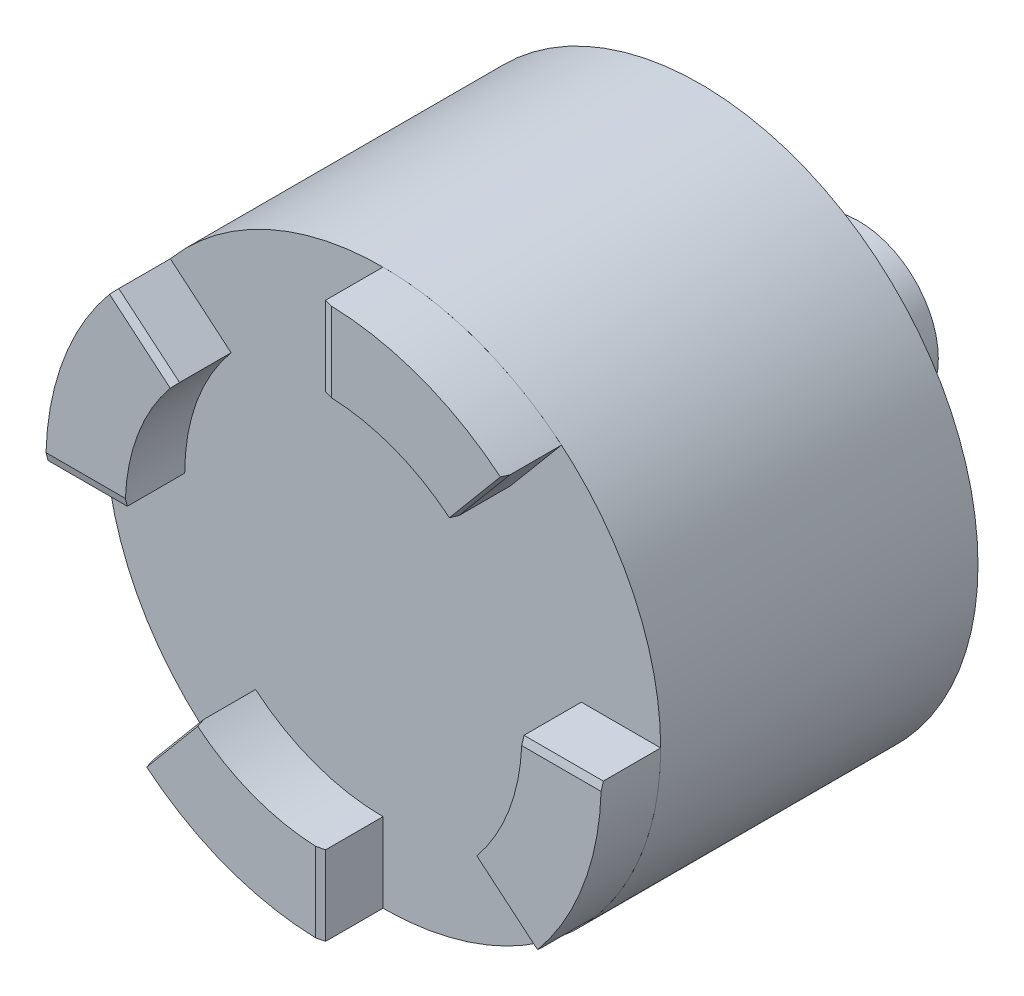
ISO-10303-21;
HEADER;
FILE_DESCRIPTION(('STEP AP214'),'2;1');
FILE_NAME('part.step','',(''),(''),'','','');
FILE_SCHEMA(('AUTOMOTIVE_DESIGN { 1 0 10303 214 1 1 1 1 }'));
ENDSEC;
DATA;
#1=APPLICATION_CONTEXT('core data for automotive mechanical design processes');
#2=APPLICATION_PROTOCOL_DEFINITION('international standard','automotive_design',2000,#1);
#3=PRODUCT_CONTEXT('',#1,'mechanical');
#4=PRODUCT('Part','Part','',(#3));
#5=PRODUCT_RELATED_PRODUCT_CATEGORY('part','',(#4));
#6=PRODUCT_DEFINITION_FORMATION('','',#4);
#7=PRODUCT_DEFINITION_CONTEXT('part definition',#1,'design');
#8=PRODUCT_DEFINITION('design','',#6,#7);
#9=PRODUCT_DEFINITION_SHAPE('','',#8);
#10=(LENGTH_UNIT() NAMED_UNIT(*) SI_UNIT(.MILLI.,.METRE.));
#11=(NAMED_UNIT(*) PLANE_ANGLE_UNIT() SI_UNIT($,.RADIAN.));
#12=(NAMED_UNIT(*) SI_UNIT($,.STERADIAN.) SOLID_ANGLE_UNIT());
#13=UNCERTAINTY_MEASURE_WITH_UNIT(LENGTH_MEASURE(1.E-05),#10,'distance_accuracy_value','');
#14=(GEOMETRIC_REPRESENTATION_CONTEXT(3) GLOBAL_UNCERTAINTY_ASSIGNED_CONTEXT((#13)) GLOBAL_UNIT_ASSIGNED_CONTEXT((#10,
#11,#12)) REPRESENTATION_CONTEXT('',''));
#15=CARTESIAN_POINT('',(0.,0.,0.));
#16=DIRECTION('',(0.,0.,1.));
#17=DIRECTION('',(1.,0.,0.));
#18=AXIS2_PLACEMENT_3D('',#15,#16,#17);
#19=CARTESIAN_POINT('',(-38.5953117709004,-1.19138897138363,29.1756320835275));
#20=DIRECTION('',(0.,0.,-1.));
#21=DIRECTION('',(-1.,0.,0.));
#22=AXIS2_PLACEMENT_3D('',#19,#20,#21);
#23=CYLINDRICAL_SURFACE('',#22,7.);
#24=CARTESIAN_POINT('',(-38.5953117709004,-1.19138897138363,29.1756320835275));
#25=DIRECTION('',(0.,0.,1.));
#26=DIRECTION('',(1.,0.,0.));
#27=AXIS2_PLACEMENT_3D('',#24,#25,#26);
#28=CIRCLE('',#27,7.);
#29=CARTESIAN_POINT('',(-31.5953117709004,-1.19138897138363,29.1756320835275));
#30=VERTEX_POINT('',#29);
#31=EDGE_CURVE('E11',#30,#30,#28,.T.);
#32=ORIENTED_EDGE('',*,*,#31,.F.);
#33=EDGE_LOOP('',(#32));
#34=FACE_BOUND('',#33,.T.);
#35=CARTESIAN_POINT('',(-38.5953117709004,-1.19138897138363,21.1756320835275));
#36=DIRECTION('',(0.,0.,1.));
#37=DIRECTION('',(1.,0.,0.));
#38=AXIS2_PLACEMENT_3D('',#35,#36,#37);
#39=CIRCLE('',#38,7.);
#40=CARTESIAN_POINT('',(-31.5953117709004,-1.19138897138363,21.1756320835275));
#41=VERTEX_POINT('',#40);
#42=EDGE_CURVE('E61',#41,#41,#39,.T.);
#43=ORIENTED_EDGE('',*,*,#42,.T.);
#44=EDGE_LOOP('',(#43));
#45=FACE_BOUND('',#44,.T.);
#46=ADVANCED_FACE('F54',(#34,#45),#23,.T.);
#47=CARTESIAN_POINT('',(-38.5953117709004,-1.19138897138363,29.1756320835275));
#48=DIRECTION('',(0.,0.,1.));
#49=DIRECTION('',(1.,0.,0.));
#50=AXIS2_PLACEMENT_3D('',#47,#48,#49);
#51=PLANE('',#50);
#52=ORIENTED_EDGE('',*,*,#31,.T.);
#53=EDGE_LOOP('',(#52));
#54=FACE_BOUND('',#53,.T.);
#55=ADVANCED_FACE('F101',(#54),#51,.T.);
#56=CARTESIAN_POINT('',(-38.5953117709004,-1.19138897138363,21.1756320835275));
#57=DIRECTION('',(0.,0.,1.));
#58=DIRECTION('',(1.,0.,0.));
#59=AXIS2_PLACEMENT_3D('',#56,#57,#58);
#60=PLANE('',#59);
#61=CARTESIAN_POINT('',(-38.5953117709004,-1.19138897138363,21.1756320835275));
#62=DIRECTION('',(0.,0.,1.));
#63=DIRECTION('',(1.,0.,0.));
#64=AXIS2_PLACEMENT_3D('',#61,#62,#63);
#65=CIRCLE('',#64,2.);
#66=CARTESIAN_POINT('',(-36.5953117709004,-1.19138897138363,21.1756320835275));
#67=VERTEX_POINT('',#66);
#68=EDGE_CURVE('E57',#67,#67,#65,.T.);
#69=ORIENTED_EDGE('',*,*,#68,.T.);
#70=EDGE_LOOP('',(#69));
#71=FACE_BOUND('',#70,.T.);
#72=ORIENTED_EDGE('',*,*,#42,.F.);
#73=EDGE_LOOP('',(#72));
#74=FACE_BOUND('',#73,.T.);
#75=ADVANCED_FACE('F94',(#71,#74),#60,.F.);
#76=CARTESIAN_POINT('',(-38.5953117709004,-1.19138897138363,17.1756320835275));
#77=DIRECTION('',(0.,0.,1.));
#78=DIRECTION('',(1.,0.,0.));
#79=AXIS2_PLACEMENT_3D('',#76,#77,#78);
#80=CYLINDRICAL_SURFACE('',#79,2.);
#81=CARTESIAN_POINT('',(-38.5953117709004,-1.19138897138363,17.1756320835275));
#82=DIRECTION('',(0.,0.,1.));
#83=DIRECTION('',(1.,0.,0.));
#84=AXIS2_PLACEMENT_3D('',#81,#82,#83);
#85=CIRCLE('',#84,2.);
#86=CARTESIAN_POINT('',(-36.5953117709004,-1.19138897138363,17.1756320835275));
#87=VERTEX_POINT('',#86);
#88=EDGE_CURVE('E67',#87,#87,#85,.T.);
#89=ORIENTED_EDGE('',*,*,#88,.T.);
#90=EDGE_LOOP('',(#89));
#91=FACE_BOUND('',#90,.T.);
#92=ORIENTED_EDGE('',*,*,#68,.F.);
#93=EDGE_LOOP('',(#92));
#94=FACE_BOUND('',#93,.T.);
#95=ADVANCED_FACE('F88',(#91,#94),#80,.T.);
#96=CARTESIAN_POINT('',(-38.5953117709004,-1.19138897138363,17.1756320835275));
#97=DIRECTION('',(0.,0.,1.));
#98=DIRECTION('',(1.,0.,0.));
#99=AXIS2_PLACEMENT_3D('',#96,#97,#98);
#100=PLANE('',#99);
#101=CARTESIAN_POINT('',(-38.5953117709004,-1.19138897138363,17.1756320835275));
#102=DIRECTION('',(0.,0.,-1.));
#103=DIRECTION('',(-1.,0.,0.));
#104=AXIS2_PLACEMENT_3D('',#101,#102,#103);
#105=CIRCLE('',#104,1.025);
#106=CARTESIAN_POINT('',(-39.6203117709004,-1.19138897138363,17.1756320835275));
#107=VERTEX_POINT('',#106);
#108=EDGE_CURVE('E71',#107,#107,#105,.T.);
#109=ORIENTED_EDGE('',*,*,#108,.F.);
#110=EDGE_LOOP('',(#109));
#111=FACE_BOUND('',#110,.T.);
#112=ORIENTED_EDGE('',*,*,#88,.F.);
#113=EDGE_LOOP('',(#112));
#114=FACE_BOUND('',#113,.T.);
#115=ADVANCED_FACE('F82',(#111,#114),#100,.F.);
#116=CARTESIAN_POINT('',(-38.5953117709004,-1.19138897138363,25.1756320835275));
#117=DIRECTION('',(0.,0.,-1.));
#118=DIRECTION('',(-1.,0.,0.));
#119=AXIS2_PLACEMENT_3D('',#116,#117,#118);
#120=CYLINDRICAL_SURFACE('',#119,1.025);
#121=CARTESIAN_POINT('',(-38.5953117709004,-1.19138897138363,25.1756320835275));
#122=DIRECTION('',(0.,0.,-1.));
#123=DIRECTION('',(-1.,0.,0.));
#124=AXIS2_PLACEMENT_3D('',#121,#122,#123);
#125=CIRCLE('',#124,1.025);
#126=CARTESIAN_POINT('',(-39.6203117709004,-1.19138897138363,25.1756320835275));
#127=VERTEX_POINT('',#126);
#128=EDGE_CURVE('E70',#127,#127,#125,.T.);
#129=ORIENTED_EDGE('',*,*,#128,.F.);
#130=EDGE_LOOP('',(#129));
#131=FACE_BOUND('',#130,.T.);
#132=ORIENTED_EDGE('',*,*,#108,.T.);
#133=EDGE_LOOP('',(#132));
#134=FACE_BOUND('',#133,.T.);
#135=ADVANCED_FACE('F79',(#131,#134),#120,.F.);
#136=CARTESIAN_POINT('',(-38.5953117709004,-1.19138897138363,25.1756320835275));
#137=DIRECTION('',(0.,0.,-1.));
#138=DIRECTION('',(-1.,0.,0.));
#139=AXIS2_PLACEMENT_3D('',#136,#137,#138);
#140=PLANE('',#139);
#141=ORIENTED_EDGE('',*,*,#128,.T.);
#142=EDGE_LOOP('',(#141));
#143=FACE_BOUND('',#142,.T.);
#144=ADVANCED_FACE('F77',(#143),#140,.T.);
#145=CLOSED_SHELL('',(#46,#55,#75,#95,#115,#135,#144));
#146=MANIFOLD_SOLID_BREP('B2',#145);
#147=CARTESIAN_POINT('',(-38.5953117709004,-1.19138897138363,30.6756320835275));
#148=DIRECTION('',(0.,-1.,0.));
#149=DIRECTION('',(0.,0.,1.));
#150=AXIS2_PLACEMENT_3D('',#147,#148,#149);
#151=PLANE('',#150);
#152=DIRECTION('',(0.,0.,-1.));
#153=VECTOR('',#152,1.);
#154=CARTESIAN_POINT('',(-43.5953117709004,-1.19138897138358,30.6756320835275));
#155=LINE('',#154,#153);
#156=CARTESIAN_POINT('',(-43.5953117709004,-1.19138897138358,30.6220422450412));
#157=VERTEX_POINT('',#156);
#158=CARTESIAN_POINT('',(-43.5953117709004,-1.19138897138358,29.1756320835275));
#159=VERTEX_POINT('',#158);
#160=EDGE_CURVE('E230',#157,#159,#155,.T.);
#161=ORIENTED_EDGE('',*,*,#160,.F.);
#162=DIRECTION('',(-1.,0.,0.));
#163=VECTOR('',#162,1.);
#164=CARTESIAN_POINT('',(-38.5953117709004,-1.19138897138363,30.6220422450412));
#165=LINE('',#164,#163);
#166=CARTESIAN_POINT('',(-45.5953117709004,-1.19138897138355,30.6220422450412));
#167=VERTEX_POINT('',#166);
#168=EDGE_CURVE('E240',#157,#167,#165,.T.);
#169=ORIENTED_EDGE('',*,*,#168,.T.);
#170=DIRECTION('',(0.,0.,-1.));
#171=VECTOR('',#170,1.);
#172=CARTESIAN_POINT('',(-45.5953117709004,-1.19138897138355,30.6756320835275));
#173=LINE('',#172,#171);
#174=CARTESIAN_POINT('',(-45.5953117709004,-1.19138897138355,29.1756320835275));
#175=VERTEX_POINT('',#174);
#176=EDGE_CURVE('E252',#167,#175,#173,.T.);
#177=ORIENTED_EDGE('',*,*,#176,.T.);
#178=DIRECTION('',(-1.,0.,0.));
#179=VECTOR('',#178,1.);
#180=CARTESIAN_POINT('',(-38.5953117709004,-1.19138897138363,29.1756320835275));
#181=LINE('',#180,#179);
#182=EDGE_CURVE('E247',#159,#175,#181,.T.);
#183=ORIENTED_EDGE('',*,*,#182,.F.);
#184=EDGE_LOOP('',(#161,#169,#177,#183));
#185=FACE_BOUND('',#184,.T.);
#186=ADVANCED_FACE('F177',(#185),#151,.T.);
#187=CARTESIAN_POINT('',(-38.5953117709004,-1.19138897138363,30.6756320835275));
#188=DIRECTION('',(0.,0.,-1.));
#189=DIRECTION('',(0.,-1.,0.));
#190=AXIS2_PLACEMENT_3D('',#187,#188,#189);
#191=CYLINDRICAL_SURFACE('',#190,5.);
#192=CARTESIAN_POINT('',(-38.5953117709004,-1.19138897138363,30.6756320835275));
#193=DIRECTION('',(0.,0.,1.));
#194=DIRECTION('',(0.,1.,0.));
#195=AXIS2_PLACEMENT_3D('',#192,#193,#194);
#196=CIRCLE('',#195,5.);
#197=CARTESIAN_POINT('',(-43.5913101696191,-0.991388971383578,30.6756320835275));
#198=VERTEX_POINT('',#197);
#199=CARTESIAN_POINT('',(-42.4597608662949,1.98131227347133,30.6756320835275));
#200=VERTEX_POINT('',#199);
#201=EDGE_CURVE('E262',#198,#200,#196,.F.);
#202=ORIENTED_EDGE('',*,*,#201,.F.);
#203=CARTESIAN_POINT('',(-38.5953117709004,-1.19138897138363,30.6220422450412));
#204=DIRECTION('',(0.,0.258819045102524,-0.965925826289067));
#205=DIRECTION('',(0.,-0.965925826289068,-0.258819045102524));
#206=AXIS2_PLACEMENT_3D('',#203,#204,#205);
#207=ELLIPSE('',#206,5.17638090205042,5.);
#208=EDGE_CURVE('E186',#198,#157,#207,.F.);
#209=ORIENTED_EDGE('',*,*,#208,.T.);
#210=ORIENTED_EDGE('',*,*,#160,.T.);
#211=CARTESIAN_POINT('',(-38.5953117709004,-1.19138897138363,29.1756320835275));
#212=DIRECTION('',(0.,0.,1.));
#213=DIRECTION('',(0.,1.,0.));
#214=AXIS2_PLACEMENT_3D('',#211,#212,#213);
#215=CIRCLE('',#214,5.);
#216=CARTESIAN_POINT('',(-42.4255339864952,2.02254907704911,29.1756320835275));
#217=VERTEX_POINT('',#216);
#218=EDGE_CURVE('E233',#159,#217,#215,.F.);
#219=ORIENTED_EDGE('',*,*,#218,.T.);
#220=DIRECTION('',(0.,0.,-1.));
#221=VECTOR('',#220,1.);
#222=CARTESIAN_POINT('',(-42.4255339864952,2.02254907704911,30.6756320835275));
#223=LINE('',#222,#221);
#224=CARTESIAN_POINT('',(-42.4255339864952,2.02254907704911,30.4756320835275));
#225=VERTEX_POINT('',#224);
#226=EDGE_CURVE('E241',#225,#217,#223,.T.);
#227=ORIENTED_EDGE('',*,*,#226,.F.);
#228=CARTESIAN_POINT('',(-38.5953117709004,-1.19138897138363,30.4756320835275));
#229=DIRECTION('',(0.620885153014855,0.739942111693841,0.258819045102516));
#230=DIRECTION('',(0.166365675342801,0.198266891274141,-0.96592582628907));
#231=AXIS2_PLACEMENT_3D('',#228,#229,#230);
#232=ELLIPSE('',#231,19.3185165257817,5.);
#233=EDGE_CURVE('E198',#225,#200,#232,.T.);
#234=ORIENTED_EDGE('',*,*,#233,.T.);
#235=EDGE_LOOP('',(#202,#209,#210,#219,#227,#234));
#236=FACE_BOUND('',#235,.T.);
#237=ADVANCED_FACE('F232',(#236),#191,.F.);
#238=CARTESIAN_POINT('',(-38.5953117709004,-1.19138897138363,30.6756320835275));
#239=DIRECTION('',(-0.642787609686548,-0.76604444311897,0.));
#240=DIRECTION('',(0.76604444311897,-0.642787609686548,0.));
#241=AXIS2_PLACEMENT_3D('',#238,#239,#240);
#242=PLANE('',#241);
#243=DIRECTION('',(0.,0.,-1.));
#244=VECTOR('',#243,1.);
#245=CARTESIAN_POINT('',(-43.9576228727332,3.30812429642221,30.6756320835275));
#246=LINE('',#245,#244);
#247=CARTESIAN_POINT('',(-43.9576228727332,3.30812429642221,30.4756320835275));
#248=VERTEX_POINT('',#247);
#249=CARTESIAN_POINT('',(-43.9576228727332,3.30812429642221,29.1756320835275));
#250=VERTEX_POINT('',#249);
#251=EDGE_CURVE('E264',#248,#250,#246,.T.);
#252=ORIENTED_EDGE('',*,*,#251,.F.);
#253=DIRECTION('',(0.76604444311897,-0.642787609686548,0.));
#254=VECTOR('',#253,1.);
#255=CARTESIAN_POINT('',(-42.4255339864952,2.02254907704911,30.4756320835275));
#256=LINE('',#255,#254);
#257=EDGE_CURVE('E52',#248,#225,#256,.T.);
#258=ORIENTED_EDGE('',*,*,#257,.T.);
#259=ORIENTED_EDGE('',*,*,#226,.T.);
#260=DIRECTION('',(-0.76604444311897,0.642787609686548,0.));
#261=VECTOR('',#260,1.);
#262=CARTESIAN_POINT('',(-38.5953117709004,-1.19138897138363,29.1756320835275));
#263=LINE('',#262,#261);
#264=EDGE_CURVE('E249',#217,#250,#263,.T.);
#265=ORIENTED_EDGE('',*,*,#264,.T.);
#266=EDGE_LOOP('',(#252,#258,#259,#265));
#267=FACE_BOUND('',#266,.T.);
#268=ADVANCED_FACE('F287',(#267),#242,.F.);
#269=CARTESIAN_POINT('',(-38.5953117709004,-1.19138897138363,30.6756320835275));
#270=DIRECTION('',(0.,0.,-1.));
#271=DIRECTION('',(0.,-1.,0.));
#272=AXIS2_PLACEMENT_3D('',#269,#270,#271);
#273=CYLINDRICAL_SURFACE('',#272,7.);
#274=ORIENTED_EDGE('',*,*,#176,.F.);
#275=CARTESIAN_POINT('',(-38.5953117709004,-1.19138897138363,30.6220422450412));
#276=DIRECTION('',(0.,0.258819045102524,-0.965925826289067));
#277=DIRECTION('',(0.,-0.965925826289068,-0.258819045102524));
#278=AXIS2_PLACEMENT_3D('',#275,#276,#277);
#279=ELLIPSE('',#278,7.24693326287059,7.);
#280=CARTESIAN_POINT('',(-45.5924540447147,-0.991388971383557,30.6756320835275));
#281=VERTEX_POINT('',#280);
#282=EDGE_CURVE('E270',#167,#281,#279,.T.);
#283=ORIENTED_EDGE('',*,*,#282,.T.);
#284=CARTESIAN_POINT('',(-38.5953117709004,-1.19138897138363,30.6756320835275));
#285=DIRECTION('',(0.,0.,1.));
#286=DIRECTION('',(0.,1.,0.));
#287=AXIS2_PLACEMENT_3D('',#284,#285,#286);
#288=CIRCLE('',#287,7.);
#289=CARTESIAN_POINT('',(-43.991912613139,3.26694023915584,30.6756320835275));
#290=VERTEX_POINT('',#289);
#291=EDGE_CURVE('E256',#290,#281,#288,.T.);
#292=ORIENTED_EDGE('',*,*,#291,.F.);
#293=CARTESIAN_POINT('',(-38.5953117709004,-1.19138897138363,30.4756320835275));
#294=DIRECTION('',(0.620885153014855,0.739942111693841,0.258819045102516));
#295=DIRECTION('',(0.166365675342801,0.198266891274141,-0.96592582628907));
#296=AXIS2_PLACEMENT_3D('',#293,#294,#295);
#297=ELLIPSE('',#296,27.0459231360944,7.);
#298=EDGE_CURVE('E268',#290,#248,#297,.F.);
#299=ORIENTED_EDGE('',*,*,#298,.T.);
#300=ORIENTED_EDGE('',*,*,#251,.T.);
#301=CARTESIAN_POINT('',(-38.5953117709004,-1.19138897138363,29.1756320835275));
#302=DIRECTION('',(0.,0.,1.));
#303=DIRECTION('',(0.,1.,0.));
#304=AXIS2_PLACEMENT_3D('',#301,#302,#303);
#305=CIRCLE('',#304,7.);
#306=EDGE_CURVE('E260',#250,#175,#305,.T.);
#307=ORIENTED_EDGE('',*,*,#306,.T.);
#308=EDGE_LOOP('',(#274,#283,#292,#299,#300,#307));
#309=FACE_BOUND('',#308,.T.);
#310=ADVANCED_FACE('F286',(#309),#273,.T.);
#311=CARTESIAN_POINT('',(-38.5953117709004,-1.19138897138363,30.6756320835275));
#312=DIRECTION('',(0.,0.,1.));
#313=DIRECTION('',(0.,1.,0.));
#314=AXIS2_PLACEMENT_3D('',#311,#312,#313);
#315=PLANE('',#314);
#316=ORIENTED_EDGE('',*,*,#291,.T.);
#317=DIRECTION('',(1.,0.,0.));
#318=VECTOR('',#317,1.);
#319=CARTESIAN_POINT('',(-38.5953117709004,-0.99138897138363,30.6756320835275));
#320=LINE('',#319,#318);
#321=EDGE_CURVE('E275',#281,#198,#320,.T.);
#322=ORIENTED_EDGE('',*,*,#321,.T.);
#323=ORIENTED_EDGE('',*,*,#201,.T.);
#324=DIRECTION('',(-0.76604444311897,0.642787609686548,0.));
#325=VECTOR('',#324,1.);
#326=CARTESIAN_POINT('',(-43.9920697569172,3.2670720984422,30.6756320835275));
#327=LINE('',#326,#325);
#328=EDGE_CURVE('E272',#200,#290,#327,.T.);
#329=ORIENTED_EDGE('',*,*,#328,.T.);
#330=EDGE_LOOP('',(#316,#322,#323,#329));
#331=FACE_BOUND('',#330,.T.);
#332=ADVANCED_FACE('F280',(#331),#315,.T.);
#333=CARTESIAN_POINT('',(-38.5953117709004,-1.19138897138363,29.1756320835275));
#334=DIRECTION('',(0.,0.,1.));
#335=DIRECTION('',(0.,1.,0.));
#336=AXIS2_PLACEMENT_3D('',#333,#334,#335);
#337=PLANE('',#336);
#338=ORIENTED_EDGE('',*,*,#182,.T.);
#339=ORIENTED_EDGE('',*,*,#306,.F.);
#340=ORIENTED_EDGE('',*,*,#264,.F.);
#341=ORIENTED_EDGE('',*,*,#218,.F.);
#342=EDGE_LOOP('',(#338,#339,#340,#341));
#343=FACE_BOUND('',#342,.T.);
#344=ADVANCED_FACE('F245',(#343),#337,.F.);
#345=CARTESIAN_POINT('',(-38.5953117709004,-1.19138897138363,30.6220422450412));
#346=DIRECTION('',(0.,0.258819045102524,-0.965925826289067));
#347=DIRECTION('',(-1.,0.,0.));
#348=AXIS2_PLACEMENT_3D('',#345,#346,#347);
#349=PLANE('',#348);
#350=ORIENTED_EDGE('',*,*,#208,.F.);
#351=ORIENTED_EDGE('',*,*,#321,.F.);
#352=ORIENTED_EDGE('',*,*,#282,.F.);
#353=ORIENTED_EDGE('',*,*,#168,.F.);
#354=EDGE_LOOP('',(#350,#351,#352,#353));
#355=FACE_BOUND('',#354,.T.);
#356=ADVANCED_FACE('F284',(#355),#349,.F.);
#357=CARTESIAN_POINT('',(-38.6297586550844,-1.23244116936364,30.6756320835275));
#358=DIRECTION('',(0.620885153014855,0.739942111693841,0.258819045102516));
#359=DIRECTION('',(0.76604444311897,-0.642787609686548,0.));
#360=AXIS2_PLACEMENT_3D('',#357,#358,#359);
#361=PLANE('',#360);
#362=ORIENTED_EDGE('',*,*,#233,.F.);
#363=ORIENTED_EDGE('',*,*,#257,.F.);
#364=ORIENTED_EDGE('',*,*,#298,.F.);
#365=ORIENTED_EDGE('',*,*,#328,.F.);
#366=EDGE_LOOP('',(#362,#363,#364,#365));
#367=FACE_BOUND('',#366,.T.);
#368=ADVANCED_FACE('F180',(#367),#361,.T.);
#369=CLOSED_SHELL('',(#186,#237,#268,#310,#332,#344,#356,#368));
#370=MANIFOLD_SOLID_BREP('B6',#369);
#371=CARTESIAN_POINT('',(-38.5953117709004,-1.19138897138363,30.6756320835275));
#372=DIRECTION('',(1.,0.,0.));
#373=DIRECTION('',(0.,0.,1.));
#374=AXIS2_PLACEMENT_3D('',#371,#372,#373);
#375=PLANE('',#374);
#376=DIRECTION('',(0.,0.,-1.));
#377=VECTOR('',#376,1.);
#378=CARTESIAN_POINT('',(-38.5953117709004,-6.19138897138363,30.6756320835275));
#379=LINE('',#378,#377);
#380=CARTESIAN_POINT('',(-38.5953117709004,-6.19138897138363,30.6220422450412));
#381=VERTEX_POINT('',#380);
#382=CARTESIAN_POINT('',(-38.5953117709004,-6.19138897138363,29.1756320835275));
#383=VERTEX_POINT('',#382);
#384=EDGE_CURVE('E431',#381,#383,#379,.T.);
#385=ORIENTED_EDGE('',*,*,#384,.F.);
#386=DIRECTION('',(0.,-1.,0.));
#387=VECTOR('',#386,1.);
#388=CARTESIAN_POINT('',(-38.5953117709004,-1.19138897138363,30.6220422450412));
#389=LINE('',#388,#387);
#390=CARTESIAN_POINT('',(-38.5953117709004,-8.19138897138363,30.6220422450412));
#391=VERTEX_POINT('',#390);
#392=EDGE_CURVE('E441',#381,#391,#389,.T.);
#393=ORIENTED_EDGE('',*,*,#392,.T.);
#394=DIRECTION('',(0.,0.,-1.));
#395=VECTOR('',#394,1.);
#396=CARTESIAN_POINT('',(-38.5953117709004,-8.19138897138363,30.6756320835275));
#397=LINE('',#396,#395);
#398=CARTESIAN_POINT('',(-38.5953117709004,-8.19138897138363,29.1756320835275));
#399=VERTEX_POINT('',#398);
#400=EDGE_CURVE('E453',#391,#399,#397,.T.);
#401=ORIENTED_EDGE('',*,*,#400,.T.);
#402=DIRECTION('',(0.,-1.,0.));
#403=VECTOR('',#402,1.);
#404=CARTESIAN_POINT('',(-38.5953117709004,-1.19138897138363,29.1756320835275));
#405=LINE('',#404,#403);
#406=EDGE_CURVE('E448',#383,#399,#405,.T.);
#407=ORIENTED_EDGE('',*,*,#406,.F.);
#408=EDGE_LOOP('',(#385,#393,#401,#407));
#409=FACE_BOUND('',#408,.T.);
#410=ADVANCED_FACE('F378',(#409),#375,.T.);
#411=CARTESIAN_POINT('',(-38.5953117709004,-1.19138897138363,30.6756320835275));
#412=DIRECTION('',(0.,0.,-1.));
#413=DIRECTION('',(1.,0.,0.));
#414=AXIS2_PLACEMENT_3D('',#411,#412,#413);
#415=CYLINDRICAL_SURFACE('',#414,5.);
#416=CARTESIAN_POINT('',(-38.5953117709004,-1.19138897138363,30.6756320835275));
#417=DIRECTION('',(0.,0.,1.));
#418=DIRECTION('',(-1.,0.,0.));
#419=AXIS2_PLACEMENT_3D('',#416,#417,#418);
#420=CIRCLE('',#419,5.);
#421=CARTESIAN_POINT('',(-38.7953117709004,-6.18738737010235,30.6756320835275));
#422=VERTEX_POINT('',#421);
#423=CARTESIAN_POINT('',(-41.7680130157553,-5.05583806677821,30.6756320835275));
#424=VERTEX_POINT('',#423);
#425=EDGE_CURVE('E463',#422,#424,#420,.F.);
#426=ORIENTED_EDGE('',*,*,#425,.F.);
#427=CARTESIAN_POINT('',(-38.5953117709004,-1.19138897138363,30.6220422450412));
#428=DIRECTION('',(-0.258819045102524,0.,-0.965925826289067));
#429=DIRECTION('',(0.965925826289068,0.,-0.258819045102524));
#430=AXIS2_PLACEMENT_3D('',#427,#428,#429);
#431=ELLIPSE('',#430,5.17638090205042,5.);
#432=EDGE_CURVE('E387',#422,#381,#431,.F.);
#433=ORIENTED_EDGE('',*,*,#432,.T.);
#434=ORIENTED_EDGE('',*,*,#384,.T.);
#435=CARTESIAN_POINT('',(-38.5953117709004,-1.19138897138363,29.1756320835275));
#436=DIRECTION('',(0.,0.,1.));
#437=DIRECTION('',(-1.,0.,0.));
#438=AXIS2_PLACEMENT_3D('',#435,#436,#437);
#439=CIRCLE('',#438,5.);
#440=CARTESIAN_POINT('',(-41.8092498193331,-5.02161118697851,29.1756320835275));
#441=VERTEX_POINT('',#440);
#442=EDGE_CURVE('E434',#383,#441,#439,.F.);
#443=ORIENTED_EDGE('',*,*,#442,.T.);
#444=DIRECTION('',(0.,0.,-1.));
#445=VECTOR('',#444,1.);
#446=CARTESIAN_POINT('',(-41.8092498193331,-5.02161118697851,30.6756320835275));
#447=LINE('',#446,#445);
#448=CARTESIAN_POINT('',(-41.8092498193331,-5.02161118697851,30.4756320835275));
#449=VERTEX_POINT('',#448);
#450=EDGE_CURVE('E442',#449,#441,#447,.T.);
#451=ORIENTED_EDGE('',*,*,#450,.F.);
#452=CARTESIAN_POINT('',(-38.5953117709004,-1.19138897138363,30.4756320835275));
#453=DIRECTION('',(-0.739942111693848,0.620885153014847,0.258819045102516));
#454=DIRECTION('',(-0.198266891274143,0.166365675342799,-0.96592582628907));
#455=AXIS2_PLACEMENT_3D('',#452,#453,#454);
#456=ELLIPSE('',#455,19.3185165257817,5.);
#457=EDGE_CURVE('E399',#449,#424,#456,.T.);
#458=ORIENTED_EDGE('',*,*,#457,.T.);
#459=EDGE_LOOP('',(#426,#433,#434,#443,#451,#458));
#460=FACE_BOUND('',#459,.T.);
#461=ADVANCED_FACE('F433',(#460),#415,.F.);
#462=CARTESIAN_POINT('',(-38.5953117709004,-1.19138897138363,30.6756320835275));
#463=DIRECTION('',(0.766044443118977,-0.64278760968654,0.));
#464=DIRECTION('',(0.64278760968654,0.766044443118977,0.));
#465=AXIS2_PLACEMENT_3D('',#462,#463,#464);
#466=PLANE('',#465);
#467=DIRECTION('',(0.,0.,-1.));
#468=VECTOR('',#467,1.);
#469=CARTESIAN_POINT('',(-43.0948250387062,-6.55370007321647,30.6756320835275));
#470=LINE('',#469,#468);
#471=CARTESIAN_POINT('',(-43.0948250387062,-6.55370007321647,30.4756320835275));
#472=VERTEX_POINT('',#471);
#473=CARTESIAN_POINT('',(-43.0948250387062,-6.55370007321647,29.1756320835275));
#474=VERTEX_POINT('',#473);
#475=EDGE_CURVE('E465',#472,#474,#470,.T.);
#476=ORIENTED_EDGE('',*,*,#475,.F.);
#477=DIRECTION('',(0.64278760968654,0.766044443118977,0.));
#478=VECTOR('',#477,1.);
#479=CARTESIAN_POINT('',(-41.8092498193331,-5.02161118697851,30.4756320835275));
#480=LINE('',#479,#478);
#481=EDGE_CURVE('E175',#472,#449,#480,.T.);
#482=ORIENTED_EDGE('',*,*,#481,.T.);
#483=ORIENTED_EDGE('',*,*,#450,.T.);
#484=DIRECTION('',(-0.64278760968654,-0.766044443118977,0.));
#485=VECTOR('',#484,1.);
#486=CARTESIAN_POINT('',(-38.5953117709004,-1.19138897138363,29.1756320835275));
#487=LINE('',#486,#485);
#488=EDGE_CURVE('E450',#441,#474,#487,.T.);
#489=ORIENTED_EDGE('',*,*,#488,.T.);
#490=EDGE_LOOP('',(#476,#482,#483,#489));
#491=FACE_BOUND('',#490,.T.);
#492=ADVANCED_FACE('F488',(#491),#466,.F.);
#493=CARTESIAN_POINT('',(-38.5953117709004,-1.19138897138363,30.6756320835275));
#494=DIRECTION('',(0.,0.,-1.));
#495=DIRECTION('',(1.,0.,0.));
#496=AXIS2_PLACEMENT_3D('',#493,#494,#495);
#497=CYLINDRICAL_SURFACE('',#496,7.);
#498=ORIENTED_EDGE('',*,*,#400,.F.);
#499=CARTESIAN_POINT('',(-38.5953117709004,-1.19138897138363,30.6220422450412));
#500=DIRECTION('',(-0.258819045102524,0.,-0.965925826289067));
#501=DIRECTION('',(0.965925826289068,0.,-0.258819045102524));
#502=AXIS2_PLACEMENT_3D('',#499,#500,#501);
#503=ELLIPSE('',#502,7.24693326287059,7.);
#504=CARTESIAN_POINT('',(-38.7953117709004,-8.18853124519799,30.6756320835275));
#505=VERTEX_POINT('',#504);
#506=EDGE_CURVE('E471',#391,#505,#503,.T.);
#507=ORIENTED_EDGE('',*,*,#506,.T.);
#508=CARTESIAN_POINT('',(-38.5953117709004,-1.19138897138363,30.6756320835275));
#509=DIRECTION('',(0.,0.,1.));
#510=DIRECTION('',(-1.,0.,0.));
#511=AXIS2_PLACEMENT_3D('',#508,#509,#510);
#512=CIRCLE('',#511,7.);
#513=CARTESIAN_POINT('',(-43.0536409814398,-6.58798981362229,30.6756320835275));
#514=VERTEX_POINT('',#513);
#515=EDGE_CURVE('E457',#514,#505,#512,.T.);
#516=ORIENTED_EDGE('',*,*,#515,.F.);
#517=CARTESIAN_POINT('',(-38.5953117709004,-1.19138897138363,30.4756320835275));
#518=DIRECTION('',(-0.739942111693848,0.620885153014847,0.258819045102516));
#519=DIRECTION('',(-0.198266891274143,0.166365675342799,-0.96592582628907));
#520=AXIS2_PLACEMENT_3D('',#517,#518,#519);
#521=ELLIPSE('',#520,27.0459231360944,7.);
#522=EDGE_CURVE('E469',#514,#472,#521,.F.);
#523=ORIENTED_EDGE('',*,*,#522,.T.);
#524=ORIENTED_EDGE('',*,*,#475,.T.);
#525=CARTESIAN_POINT('',(-38.5953117709004,-1.19138897138363,29.1756320835275));
#526=DIRECTION('',(0.,0.,1.));
#527=DIRECTION('',(-1.,0.,0.));
#528=AXIS2_PLACEMENT_3D('',#525,#526,#527);
#529=CIRCLE('',#528,7.);
#530=EDGE_CURVE('E461',#474,#399,#529,.T.);
#531=ORIENTED_EDGE('',*,*,#530,.T.);
#532=EDGE_LOOP('',(#498,#507,#516,#523,#524,#531));
#533=FACE_BOUND('',#532,.T.);
#534=ADVANCED_FACE('F487',(#533),#497,.T.);
#535=CARTESIAN_POINT('',(-38.5953117709004,-1.19138897138363,30.6756320835275));
#536=DIRECTION('',(0.,0.,1.));
#537=DIRECTION('',(-1.,0.,0.));
#538=AXIS2_PLACEMENT_3D('',#535,#536,#537);
#539=PLANE('',#538);
#540=ORIENTED_EDGE('',*,*,#515,.T.);
#541=DIRECTION('',(0.,1.,0.));
#542=VECTOR('',#541,1.);
#543=CARTESIAN_POINT('',(-38.7953117709004,-1.19138897138363,30.6756320835275));
#544=LINE('',#543,#542);
#545=EDGE_CURVE('E476',#505,#422,#544,.T.);
#546=ORIENTED_EDGE('',*,*,#545,.T.);
#547=ORIENTED_EDGE('',*,*,#425,.T.);
#548=DIRECTION('',(-0.64278760968654,-0.766044443118977,0.));
#549=VECTOR('',#548,1.);
#550=CARTESIAN_POINT('',(-43.0537728407262,-6.58814695740052,30.6756320835275));
#551=LINE('',#550,#549);
#552=EDGE_CURVE('E473',#424,#514,#551,.T.);
#553=ORIENTED_EDGE('',*,*,#552,.T.);
#554=EDGE_LOOP('',(#540,#546,#547,#553));
#555=FACE_BOUND('',#554,.T.);
#556=ADVANCED_FACE('F481',(#555),#539,.T.);
#557=CARTESIAN_POINT('',(-38.5953117709004,-1.19138897138363,29.1756320835275));
#558=DIRECTION('',(0.,0.,1.));
#559=DIRECTION('',(-1.,0.,0.));
#560=AXIS2_PLACEMENT_3D('',#557,#558,#559);
#561=PLANE('',#560);
#562=ORIENTED_EDGE('',*,*,#406,.T.);
#563=ORIENTED_EDGE('',*,*,#530,.F.);
#564=ORIENTED_EDGE('',*,*,#488,.F.);
#565=ORIENTED_EDGE('',*,*,#442,.F.);
#566=EDGE_LOOP('',(#562,#563,#564,#565));
#567=FACE_BOUND('',#566,.T.);
#568=ADVANCED_FACE('F446',(#567),#561,.F.);
#569=CARTESIAN_POINT('',(-38.5953117709004,-1.19138897138363,30.6220422450412));
#570=DIRECTION('',(-0.258819045102524,0.,-0.965925826289067));
#571=DIRECTION('',(0.,-1.,0.));
#572=AXIS2_PLACEMENT_3D('',#569,#570,#571);
#573=PLANE('',#572);
#574=ORIENTED_EDGE('',*,*,#432,.F.);
#575=ORIENTED_EDGE('',*,*,#545,.F.);
#576=ORIENTED_EDGE('',*,*,#506,.F.);
#577=ORIENTED_EDGE('',*,*,#392,.F.);
#578=EDGE_LOOP('',(#574,#575,#576,#577));
#579=FACE_BOUND('',#578,.T.);
#580=ADVANCED_FACE('F485',(#579),#573,.F.);
#581=CARTESIAN_POINT('',(-38.5542595729204,-1.22583585556768,30.6756320835275));
#582=DIRECTION('',(-0.739942111693848,0.620885153014847,0.258819045102516));
#583=DIRECTION('',(0.64278760968654,0.766044443118977,0.));
#584=AXIS2_PLACEMENT_3D('',#581,#582,#583);
#585=PLANE('',#584);
#586=ORIENTED_EDGE('',*,*,#457,.F.);
#587=ORIENTED_EDGE('',*,*,#481,.F.);
#588=ORIENTED_EDGE('',*,*,#522,.F.);
#589=ORIENTED_EDGE('',*,*,#552,.F.);
#590=EDGE_LOOP('',(#586,#587,#588,#589));
#591=FACE_BOUND('',#590,.T.);
#592=ADVANCED_FACE('F381',(#591),#585,.T.);
#593=CLOSED_SHELL('',(#410,#461,#492,#534,#556,#568,#580,#592));
#594=MANIFOLD_SOLID_BREP('B46',#593);
#595=CARTESIAN_POINT('',(-38.5953117709004,-1.19138897138363,30.6756320835275));
#596=DIRECTION('',(0.,1.,0.));
#597=DIRECTION('',(0.,0.,1.));
#598=AXIS2_PLACEMENT_3D('',#595,#596,#597);
#599=PLANE('',#598);
#600=DIRECTION('',(0.,0.,-1.));
#601=VECTOR('',#600,1.);
#602=CARTESIAN_POINT('',(-33.5953117709004,-1.19138897138365,30.6756320835275));
#603=LINE('',#602,#601);
#604=CARTESIAN_POINT('',(-33.5953117709004,-1.19138897138365,30.6220422450412));
#605=VERTEX_POINT('',#604);
#606=CARTESIAN_POINT('',(-33.5953117709004,-1.19138897138365,29.1756320835275));
#607=VERTEX_POINT('',#606);
#608=EDGE_CURVE('E631',#605,#607,#603,.T.);
#609=ORIENTED_EDGE('',*,*,#608,.F.);
#610=DIRECTION('',(1.,0.,0.));
#611=VECTOR('',#610,1.);
#612=CARTESIAN_POINT('',(-38.5953117709004,-1.19138897138363,30.6220422450412));
#613=LINE('',#612,#611);
#614=CARTESIAN_POINT('',(-31.5953117709004,-1.19138897138365,30.6220422450412));
#615=VERTEX_POINT('',#614);
#616=EDGE_CURVE('E641',#605,#615,#613,.T.);
#617=ORIENTED_EDGE('',*,*,#616,.T.);
#618=DIRECTION('',(0.,0.,-1.));
#619=VECTOR('',#618,1.);
#620=CARTESIAN_POINT('',(-31.5953117709004,-1.19138897138365,30.6756320835275));
#621=LINE('',#620,#619);
#622=CARTESIAN_POINT('',(-31.5953117709004,-1.19138897138365,29.1756320835275));
#623=VERTEX_POINT('',#622);
#624=EDGE_CURVE('E653',#615,#623,#621,.T.);
#625=ORIENTED_EDGE('',*,*,#624,.T.);
#626=DIRECTION('',(1.,0.,0.));
#627=VECTOR('',#626,1.);
#628=CARTESIAN_POINT('',(-38.5953117709004,-1.19138897138363,29.1756320835275));
#629=LINE('',#628,#627);
#630=EDGE_CURVE('E648',#607,#623,#629,.T.);
#631=ORIENTED_EDGE('',*,*,#630,.F.);
#632=EDGE_LOOP('',(#609,#617,#625,#631));
#633=FACE_BOUND('',#632,.T.);
#634=ADVANCED_FACE('F578',(#633),#599,.T.);
#635=CARTESIAN_POINT('',(-38.5953117709004,-1.19138897138363,30.6756320835275));
#636=DIRECTION('',(0.,0.,-1.));
#637=DIRECTION('',(0.,1.,0.));
#638=AXIS2_PLACEMENT_3D('',#635,#636,#637);
#639=CYLINDRICAL_SURFACE('',#638,5.);
#640=CARTESIAN_POINT('',(-38.5953117709004,-1.19138897138363,30.6756320835275));
#641=DIRECTION('',(0.,0.,1.));
#642=DIRECTION('',(0.,-1.,0.));
#643=AXIS2_PLACEMENT_3D('',#640,#641,#642);
#644=CIRCLE('',#643,5.);
#645=CARTESIAN_POINT('',(-33.5993133721817,-1.39138897138364,30.6756320835275));
#646=VERTEX_POINT('',#645);
#647=CARTESIAN_POINT('',(-34.7308626755058,-4.36409021623856,30.6756320835275));
#648=VERTEX_POINT('',#647);
#649=EDGE_CURVE('E663',#646,#648,#644,.F.);
#650=ORIENTED_EDGE('',*,*,#649,.F.);
#651=CARTESIAN_POINT('',(-38.5953117709004,-1.19138897138363,30.6220422450412));
#652=DIRECTION('',(0.,-0.258819045102524,-0.965925826289067));
#653=DIRECTION('',(0.,0.965925826289068,-0.258819045102524));
#654=AXIS2_PLACEMENT_3D('',#651,#652,#653);
#655=ELLIPSE('',#654,5.17638090205042,5.);
#656=EDGE_CURVE('E587',#646,#605,#655,.F.);
#657=ORIENTED_EDGE('',*,*,#656,.T.);
#658=ORIENTED_EDGE('',*,*,#608,.T.);
#659=CARTESIAN_POINT('',(-38.5953117709004,-1.19138897138363,29.1756320835275));
#660=DIRECTION('',(0.,0.,1.));
#661=DIRECTION('',(0.,-1.,0.));
#662=AXIS2_PLACEMENT_3D('',#659,#660,#661);
#663=CIRCLE('',#662,5.);
#664=CARTESIAN_POINT('',(-34.7650895553055,-4.40532701981634,29.1756320835275));
#665=VERTEX_POINT('',#664);
#666=EDGE_CURVE('E634',#607,#665,#663,.F.);
#667=ORIENTED_EDGE('',*,*,#666,.T.);
#668=DIRECTION('',(0.,0.,-1.));
#669=VECTOR('',#668,1.);
#670=CARTESIAN_POINT('',(-34.7650895553055,-4.40532701981634,30.6756320835275));
#671=LINE('',#670,#669);
#672=CARTESIAN_POINT('',(-34.7650895553055,-4.40532701981634,30.4756320835275));
#673=VERTEX_POINT('',#672);
#674=EDGE_CURVE('E642',#673,#665,#671,.T.);
#675=ORIENTED_EDGE('',*,*,#674,.F.);
#676=CARTESIAN_POINT('',(-38.5953117709004,-1.19138897138363,30.4756320835275));
#677=DIRECTION('',(-0.62088515301485,-0.739942111693846,0.258819045102516));
#678=DIRECTION('',(-0.1663656753428,-0.198266891274142,-0.96592582628907));
#679=AXIS2_PLACEMENT_3D('',#676,#677,#678);
#680=ELLIPSE('',#679,19.3185165257817,5.);
#681=EDGE_CURVE('E599',#673,#648,#680,.T.);
#682=ORIENTED_EDGE('',*,*,#681,.T.);
#683=EDGE_LOOP('',(#650,#657,#658,#667,#675,#682));
#684=FACE_BOUND('',#683,.T.);
#685=ADVANCED_FACE('F633',(#684),#639,.F.);
#686=CARTESIAN_POINT('',(-38.5953117709004,-1.19138897138363,30.6756320835275));
#687=DIRECTION('',(0.642787609686543,0.766044443118975,0.));
#688=DIRECTION('',(-0.766044443118975,0.642787609686543,0.));
#689=AXIS2_PLACEMENT_3D('',#686,#687,#688);
#690=PLANE('',#689);
#691=DIRECTION('',(0.,0.,-1.));
#692=VECTOR('',#691,1.);
#693=CARTESIAN_POINT('',(-33.2330006690676,-5.69090223918943,30.6756320835275));
#694=LINE('',#693,#692);
#695=CARTESIAN_POINT('',(-33.2330006690676,-5.69090223918943,30.4756320835275));
#696=VERTEX_POINT('',#695);
#697=CARTESIAN_POINT('',(-33.2330006690676,-5.69090223918943,29.1756320835275));
#698=VERTEX_POINT('',#697);
#699=EDGE_CURVE('E665',#696,#698,#694,.T.);
#700=ORIENTED_EDGE('',*,*,#699,.F.);
#701=DIRECTION('',(-0.766044443118975,0.642787609686543,0.));
#702=VECTOR('',#701,1.);
#703=CARTESIAN_POINT('',(-34.7650895553055,-4.40532701981634,30.4756320835275));
#704=LINE('',#703,#702);
#705=EDGE_CURVE('E376',#696,#673,#704,.T.);
#706=ORIENTED_EDGE('',*,*,#705,.T.);
#707=ORIENTED_EDGE('',*,*,#674,.T.);
#708=DIRECTION('',(0.766044443118975,-0.642787609686543,0.));
#709=VECTOR('',#708,1.);
#710=CARTESIAN_POINT('',(-38.5953117709004,-1.19138897138363,29.1756320835275));
#711=LINE('',#710,#709);
#712=EDGE_CURVE('E650',#665,#698,#711,.T.);
#713=ORIENTED_EDGE('',*,*,#712,.T.);
#714=EDGE_LOOP('',(#700,#706,#707,#713));
#715=FACE_BOUND('',#714,.T.);
#716=ADVANCED_FACE('F688',(#715),#690,.F.);
#717=CARTESIAN_POINT('',(-38.5953117709004,-1.19138897138363,30.6756320835275));
#718=DIRECTION('',(0.,0.,-1.));
#719=DIRECTION('',(0.,1.,0.));
#720=AXIS2_PLACEMENT_3D('',#717,#718,#719);
#721=CYLINDRICAL_SURFACE('',#720,7.);
#722=ORIENTED_EDGE('',*,*,#624,.F.);
#723=CARTESIAN_POINT('',(-38.5953117709004,-1.19138897138363,30.6220422450412));
#724=DIRECTION('',(0.,-0.258819045102524,-0.965925826289067));
#725=DIRECTION('',(0.,0.965925826289068,-0.258819045102524));
#726=AXIS2_PLACEMENT_3D('',#723,#724,#725);
#727=ELLIPSE('',#726,7.24693326287059,7.);
#728=CARTESIAN_POINT('',(-31.598169497086,-1.39138897138365,30.6756320835275));
#729=VERTEX_POINT('',#728);
#730=EDGE_CURVE('E671',#615,#729,#727,.T.);
#731=ORIENTED_EDGE('',*,*,#730,.T.);
#732=CARTESIAN_POINT('',(-38.5953117709004,-1.19138897138363,30.6756320835275));
#733=DIRECTION('',(0.,0.,1.));
#734=DIRECTION('',(0.,-1.,0.));
#735=AXIS2_PLACEMENT_3D('',#732,#733,#734);
#736=CIRCLE('',#735,7.);
#737=CARTESIAN_POINT('',(-33.1987109286618,-5.64971818192306,30.6756320835275));
#738=VERTEX_POINT('',#737);
#739=EDGE_CURVE('E657',#738,#729,#736,.T.);
#740=ORIENTED_EDGE('',*,*,#739,.F.);
#741=CARTESIAN_POINT('',(-38.5953117709004,-1.19138897138363,30.4756320835275));
#742=DIRECTION('',(-0.62088515301485,-0.739942111693846,0.258819045102516));
#743=DIRECTION('',(-0.1663656753428,-0.198266891274142,-0.96592582628907));
#744=AXIS2_PLACEMENT_3D('',#741,#742,#743);
#745=ELLIPSE('',#744,27.0459231360944,7.);
#746=EDGE_CURVE('E669',#738,#696,#745,.F.);
#747=ORIENTED_EDGE('',*,*,#746,.T.);
#748=ORIENTED_EDGE('',*,*,#699,.T.);
#749=CARTESIAN_POINT('',(-38.5953117709004,-1.19138897138363,29.1756320835275));
#750=DIRECTION('',(0.,0.,1.));
#751=DIRECTION('',(0.,-1.,0.));
#752=AXIS2_PLACEMENT_3D('',#749,#750,#751);
#753=CIRCLE('',#752,7.);
#754=EDGE_CURVE('E661',#698,#623,#753,.T.);
#755=ORIENTED_EDGE('',*,*,#754,.T.);
#756=EDGE_LOOP('',(#722,#731,#740,#747,#748,#755));
#757=FACE_BOUND('',#756,.T.);
#758=ADVANCED_FACE('F687',(#757),#721,.T.);
#759=CARTESIAN_POINT('',(-38.5953117709004,-1.19138897138363,30.6756320835275));
#760=DIRECTION('',(0.,0.,1.));
#761=DIRECTION('',(0.,-1.,0.));
#762=AXIS2_PLACEMENT_3D('',#759,#760,#761);
#763=PLANE('',#762);
#764=ORIENTED_EDGE('',*,*,#739,.T.);
#765=DIRECTION('',(-1.,0.,0.));
#766=VECTOR('',#765,1.);
#767=CARTESIAN_POINT('',(-38.5953117709004,-1.39138897138363,30.6756320835275));
#768=LINE('',#767,#766);
#769=EDGE_CURVE('E676',#729,#646,#768,.T.);
#770=ORIENTED_EDGE('',*,*,#769,.T.);
#771=ORIENTED_EDGE('',*,*,#649,.T.);
#772=DIRECTION('',(0.766044443118975,-0.642787609686543,0.));
#773=VECTOR('',#772,1.);
#774=CARTESIAN_POINT('',(-33.1985537848835,-5.64985004120941,30.6756320835275));
#775=LINE('',#774,#773);
#776=EDGE_CURVE('E673',#648,#738,#775,.T.);
#777=ORIENTED_EDGE('',*,*,#776,.T.);
#778=EDGE_LOOP('',(#764,#770,#771,#777));
#779=FACE_BOUND('',#778,.T.);
#780=ADVANCED_FACE('F681',(#779),#763,.T.);
#781=CARTESIAN_POINT('',(-38.5953117709004,-1.19138897138363,29.1756320835275));
#782=DIRECTION('',(0.,0.,1.));
#783=DIRECTION('',(0.,-1.,0.));
#784=AXIS2_PLACEMENT_3D('',#781,#782,#783);
#785=PLANE('',#784);
#786=ORIENTED_EDGE('',*,*,#630,.T.);
#787=ORIENTED_EDGE('',*,*,#754,.F.);
#788=ORIENTED_EDGE('',*,*,#712,.F.);
#789=ORIENTED_EDGE('',*,*,#666,.F.);
#790=EDGE_LOOP('',(#786,#787,#788,#789));
#791=FACE_BOUND('',#790,.T.);
#792=ADVANCED_FACE('F646',(#791),#785,.F.);
#793=CARTESIAN_POINT('',(-38.5953117709004,-1.19138897138363,30.6220422450412));
#794=DIRECTION('',(0.,-0.258819045102524,-0.965925826289067));
#795=DIRECTION('',(1.,0.,0.));
#796=AXIS2_PLACEMENT_3D('',#793,#794,#795);
#797=PLANE('',#796);
#798=ORIENTED_EDGE('',*,*,#656,.F.);
#799=ORIENTED_EDGE('',*,*,#769,.F.);
#800=ORIENTED_EDGE('',*,*,#730,.F.);
#801=ORIENTED_EDGE('',*,*,#616,.F.);
#802=EDGE_LOOP('',(#798,#799,#800,#801));
#803=FACE_BOUND('',#802,.T.);
#804=ADVANCED_FACE('F685',(#803),#797,.F.);
#805=CARTESIAN_POINT('',(-38.5608648867163,-1.15033677340361,30.6756320835275));
#806=DIRECTION('',(-0.62088515301485,-0.739942111693846,0.258819045102516));
#807=DIRECTION('',(-0.766044443118975,0.642787609686543,0.));
#808=AXIS2_PLACEMENT_3D('',#805,#806,#807);
#809=PLANE('',#808);
#810=ORIENTED_EDGE('',*,*,#681,.F.);
#811=ORIENTED_EDGE('',*,*,#705,.F.);
#812=ORIENTED_EDGE('',*,*,#746,.F.);
#813=ORIENTED_EDGE('',*,*,#776,.F.);
#814=EDGE_LOOP('',(#810,#811,#812,#813));
#815=FACE_BOUND('',#814,.T.);
#816=ADVANCED_FACE('F581',(#815),#809,.T.);
#817=CLOSED_SHELL('',(#634,#685,#716,#758,#780,#792,#804,#816));
#818=MANIFOLD_SOLID_BREP('B169',#817);
#819=CARTESIAN_POINT('',(-38.5953117709004,-1.19138897138363,30.6756320835275));
#820=DIRECTION('',(-1.,0.,0.));
#821=DIRECTION('',(0.,0.,1.));
#822=AXIS2_PLACEMENT_3D('',#819,#820,#821);
#823=PLANE('',#822);
#824=DIRECTION('',(0.,0.,-1.));
#825=VECTOR('',#824,1.);
#826=CARTESIAN_POINT('',(-38.5953117709004,3.80861102861637,30.6756320835275));
#827=LINE('',#826,#825);
#828=CARTESIAN_POINT('',(-38.5953117709004,3.80861102861637,30.6220422450412));
#829=VERTEX_POINT('',#828);
#830=CARTESIAN_POINT('',(-38.5953117709004,3.80861102861637,29.1756320835275));
#831=VERTEX_POINT('',#830);
#832=EDGE_CURVE('E822',#829,#831,#827,.T.);
#833=ORIENTED_EDGE('',*,*,#832,.F.);
#834=DIRECTION('',(0.,1.,0.));
#835=VECTOR('',#834,1.);
#836=CARTESIAN_POINT('',(-38.5953117709004,-1.19138897138363,30.6220422450412));
#837=LINE('',#836,#835);
#838=CARTESIAN_POINT('',(-38.5953117709004,5.80861102861637,30.6220422450412));
#839=VERTEX_POINT('',#838);
#840=EDGE_CURVE('E832',#829,#839,#837,.T.);
#841=ORIENTED_EDGE('',*,*,#840,.T.);
#842=DIRECTION('',(0.,0.,-1.));
#843=VECTOR('',#842,1.);
#844=CARTESIAN_POINT('',(-38.5953117709004,5.80861102861637,30.6756320835275));
#845=LINE('',#844,#843);
#846=CARTESIAN_POINT('',(-38.5953117709004,5.80861102861637,29.1756320835275));
#847=VERTEX_POINT('',#846);
#848=EDGE_CURVE('E844',#839,#847,#845,.T.);
#849=ORIENTED_EDGE('',*,*,#848,.T.);
#850=DIRECTION('',(0.,1.,0.));
#851=VECTOR('',#850,1.);
#852=CARTESIAN_POINT('',(-38.5953117709004,-1.19138897138363,29.1756320835275));
#853=LINE('',#852,#851);
#854=EDGE_CURVE('E839',#831,#847,#853,.T.);
#855=ORIENTED_EDGE('',*,*,#854,.F.);
#856=EDGE_LOOP('',(#833,#841,#849,#855));
#857=FACE_BOUND('',#856,.T.);
#858=ADVANCED_FACE('F769',(#857),#823,.T.);
#859=CARTESIAN_POINT('',(-38.5953117709004,-1.19138897138363,30.6756320835275));
#860=DIRECTION('',(0.,0.,-1.));
#861=DIRECTION('',(-1.,0.,0.));
#862=AXIS2_PLACEMENT_3D('',#859,#860,#861);
#863=CYLINDRICAL_SURFACE('',#862,5.);
#864=CARTESIAN_POINT('',(-38.5953117709004,-1.19138897138363,30.6756320835275));
#865=DIRECTION('',(0.,0.,1.));
#866=DIRECTION('',(1.,0.,0.));
#867=AXIS2_PLACEMENT_3D('',#864,#865,#866);
#868=CIRCLE('',#867,5.);
#869=CARTESIAN_POINT('',(-38.3953117709004,3.80460942733509,30.6756320835275));
#870=VERTEX_POINT('',#869);
#871=CARTESIAN_POINT('',(-35.4226105260455,2.67306012401096,30.6756320835275));
#872=VERTEX_POINT('',#871);
#873=EDGE_CURVE('E854',#870,#872,#868,.F.);
#874=ORIENTED_EDGE('',*,*,#873,.F.);
#875=CARTESIAN_POINT('',(-38.5953117709004,-1.19138897138363,30.6220422450412));
#876=DIRECTION('',(0.258819045102524,0.,-0.965925826289067));
#877=DIRECTION('',(-0.965925826289068,0.,-0.258819045102524));
#878=AXIS2_PLACEMENT_3D('',#875,#876,#877);
#879=ELLIPSE('',#878,5.17638090205042,5.);
#880=EDGE_CURVE('E778',#870,#829,#879,.F.);
#881=ORIENTED_EDGE('',*,*,#880,.T.);
#882=ORIENTED_EDGE('',*,*,#832,.T.);
#883=CARTESIAN_POINT('',(-38.5953117709004,-1.19138897138363,29.1756320835275));
#884=DIRECTION('',(0.,0.,1.));
#885=DIRECTION('',(1.,0.,0.));
#886=AXIS2_PLACEMENT_3D('',#883,#884,#885);
#887=CIRCLE('',#886,5.);
#888=CARTESIAN_POINT('',(-35.3813737224677,2.63883324421126,29.1756320835275));
#889=VERTEX_POINT('',#888);
#890=EDGE_CURVE('E825',#831,#889,#887,.F.);
#891=ORIENTED_EDGE('',*,*,#890,.T.);
#892=DIRECTION('',(0.,0.,-1.));
#893=VECTOR('',#892,1.);
#894=CARTESIAN_POINT('',(-35.3813737224677,2.63883324421126,30.6756320835275));
#895=LINE('',#894,#893);
#896=CARTESIAN_POINT('',(-35.3813737224677,2.63883324421126,30.4756320835275));
#897=VERTEX_POINT('',#896);
#898=EDGE_CURVE('E833',#897,#889,#895,.T.);
#899=ORIENTED_EDGE('',*,*,#898,.F.);
#900=CARTESIAN_POINT('',(-38.5953117709004,-1.19138897138363,30.4756320835275));
#901=DIRECTION('',(0.739942111693848,-0.620885153014847,0.258819045102516));
#902=DIRECTION('',(0.198266891274143,-0.166365675342799,-0.96592582628907));
#903=AXIS2_PLACEMENT_3D('',#900,#901,#902);
#904=ELLIPSE('',#903,19.3185165257817,5.);
#905=EDGE_CURVE('E790',#897,#872,#904,.T.);
#906=ORIENTED_EDGE('',*,*,#905,.T.);
#907=EDGE_LOOP('',(#874,#881,#882,#891,#899,#906));
#908=FACE_BOUND('',#907,.T.);
#909=ADVANCED_FACE('F824',(#908),#863,.F.);
#910=CARTESIAN_POINT('',(-38.5953117709004,-1.19138897138363,30.6756320835275));
#911=DIRECTION('',(-0.766044443118977,0.64278760968654,0.));
#912=DIRECTION('',(-0.64278760968654,-0.766044443118977,0.));
#913=AXIS2_PLACEMENT_3D('',#910,#911,#912);
#914=PLANE('',#913);
#915=DIRECTION('',(0.,0.,-1.));
#916=VECTOR('',#915,1.);
#917=CARTESIAN_POINT('',(-34.0957985030946,4.17092213044921,30.6756320835275));
#918=LINE('',#917,#916);
#919=CARTESIAN_POINT('',(-34.0957985030946,4.17092213044921,30.4756320835275));
#920=VERTEX_POINT('',#919);
#921=CARTESIAN_POINT('',(-34.0957985030946,4.17092213044921,29.1756320835275));
#922=VERTEX_POINT('',#921);
#923=EDGE_CURVE('E856',#920,#922,#918,.T.);
#924=ORIENTED_EDGE('',*,*,#923,.F.);
#925=DIRECTION('',(-0.64278760968654,-0.766044443118977,0.));
#926=VECTOR('',#925,1.);
#927=CARTESIAN_POINT('',(-35.3813737224677,2.63883324421126,30.4756320835275));
#928=LINE('',#927,#926);
#929=EDGE_CURVE('E576',#920,#897,#928,.T.);
#930=ORIENTED_EDGE('',*,*,#929,.T.);
#931=ORIENTED_EDGE('',*,*,#898,.T.);
#932=DIRECTION('',(0.64278760968654,0.766044443118977,0.));
#933=VECTOR('',#932,1.);
#934=CARTESIAN_POINT('',(-38.5953117709004,-1.19138897138363,29.1756320835275));
#935=LINE('',#934,#933);
#936=EDGE_CURVE('E841',#889,#922,#935,.T.);
#937=ORIENTED_EDGE('',*,*,#936,.T.);
#938=EDGE_LOOP('',(#924,#930,#931,#937));
#939=FACE_BOUND('',#938,.T.);
#940=ADVANCED_FACE('F879',(#939),#914,.F.);
#941=CARTESIAN_POINT('',(-38.5953117709004,-1.19138897138363,30.6756320835275));
#942=DIRECTION('',(0.,0.,-1.));
#943=DIRECTION('',(-1.,0.,0.));
#944=AXIS2_PLACEMENT_3D('',#941,#942,#943);
#945=CYLINDRICAL_SURFACE('',#944,7.);
#946=ORIENTED_EDGE('',*,*,#848,.F.);
#947=CARTESIAN_POINT('',(-38.5953117709004,-1.19138897138363,30.6220422450412));
#948=DIRECTION('',(0.258819045102524,0.,-0.965925826289067));
#949=DIRECTION('',(-0.965925826289068,0.,-0.258819045102524));
#950=AXIS2_PLACEMENT_3D('',#947,#948,#949);
#951=ELLIPSE('',#950,7.24693326287059,7.);
#952=CARTESIAN_POINT('',(-38.3953117709004,5.80575330243073,30.6756320835275));
#953=VERTEX_POINT('',#952);
#954=EDGE_CURVE('E862',#839,#953,#951,.T.);
#955=ORIENTED_EDGE('',*,*,#954,.T.);
#956=CARTESIAN_POINT('',(-38.5953117709004,-1.19138897138363,30.6756320835275));
#957=DIRECTION('',(0.,0.,1.));
#958=DIRECTION('',(1.,0.,0.));
#959=AXIS2_PLACEMENT_3D('',#956,#957,#958);
#960=CIRCLE('',#959,7.);
#961=CARTESIAN_POINT('',(-34.136982560361,4.20521187085503,30.6756320835275));
#962=VERTEX_POINT('',#961);
#963=EDGE_CURVE('E848',#962,#953,#960,.T.);
#964=ORIENTED_EDGE('',*,*,#963,.F.);
#965=CARTESIAN_POINT('',(-38.5953117709004,-1.19138897138363,30.4756320835275));
#966=DIRECTION('',(0.739942111693848,-0.620885153014847,0.258819045102516));
#967=DIRECTION('',(0.198266891274143,-0.166365675342799,-0.96592582628907));
#968=AXIS2_PLACEMENT_3D('',#965,#966,#967);
#969=ELLIPSE('',#968,27.0459231360944,7.);
#970=EDGE_CURVE('E860',#962,#920,#969,.F.);
#971=ORIENTED_EDGE('',*,*,#970,.T.);
#972=ORIENTED_EDGE('',*,*,#923,.T.);
#973=CARTESIAN_POINT('',(-38.5953117709004,-1.19138897138363,29.1756320835275));
#974=DIRECTION('',(0.,0.,1.));
#975=DIRECTION('',(1.,0.,0.));
#976=AXIS2_PLACEMENT_3D('',#973,#974,#975);
#977=CIRCLE('',#976,7.);
#978=EDGE_CURVE('E852',#922,#847,#977,.T.);
#979=ORIENTED_EDGE('',*,*,#978,.T.);
#980=EDGE_LOOP('',(#946,#955,#964,#971,#972,#979));
#981=FACE_BOUND('',#980,.T.);
#982=ADVANCED_FACE('F878',(#981),#945,.T.);
#983=CARTESIAN_POINT('',(-38.5953117709004,-1.19138897138363,30.6756320835275));
#984=DIRECTION('',(0.,0.,1.));
#985=DIRECTION('',(1.,0.,0.));
#986=AXIS2_PLACEMENT_3D('',#983,#984,#985);
#987=PLANE('',#986);
#988=ORIENTED_EDGE('',*,*,#963,.T.);
#989=DIRECTION('',(0.,-1.,0.));
#990=VECTOR('',#989,1.);
#991=CARTESIAN_POINT('',(-38.3953117709004,-1.19138897138363,30.6756320835275));
#992=LINE('',#991,#990);
#993=EDGE_CURVE('E867',#953,#870,#992,.T.);
#994=ORIENTED_EDGE('',*,*,#993,.T.);
#995=ORIENTED_EDGE('',*,*,#873,.T.);
#996=DIRECTION('',(0.64278760968654,0.766044443118977,0.));
#997=VECTOR('',#996,1.);
#998=CARTESIAN_POINT('',(-34.1368507010746,4.20536901463326,30.6756320835275));
#999=LINE('',#998,#997);
#1000=EDGE_CURVE('E864',#872,#962,#999,.T.);
#1001=ORIENTED_EDGE('',*,*,#1000,.T.);
#1002=EDGE_LOOP('',(#988,#994,#995,#1001));
#1003=FACE_BOUND('',#1002,.T.);
#1004=ADVANCED_FACE('F872',(#1003),#987,.T.);
#1005=CARTESIAN_POINT('',(-38.5953117709004,-1.19138897138363,29.1756320835275));
#1006=DIRECTION('',(0.,0.,1.));
#1007=DIRECTION('',(1.,0.,0.));
#1008=AXIS2_PLACEMENT_3D('',#1005,#1006,#1007);
#1009=PLANE('',#1008);
#1010=ORIENTED_EDGE('',*,*,#854,.T.);
#1011=ORIENTED_EDGE('',*,*,#978,.F.);
#1012=ORIENTED_EDGE('',*,*,#936,.F.);
#1013=ORIENTED_EDGE('',*,*,#890,.F.);
#1014=EDGE_LOOP('',(#1010,#1011,#1012,#1013));
#1015=FACE_BOUND('',#1014,.T.);
#1016=ADVANCED_FACE('F837',(#1015),#1009,.F.);
#1017=CARTESIAN_POINT('',(-38.5953117709004,-1.19138897138363,30.6220422450412));
#1018=DIRECTION('',(0.258819045102524,0.,-0.965925826289067));
#1019=DIRECTION('',(0.,1.,0.));
#1020=AXIS2_PLACEMENT_3D('',#1017,#1018,#1019);
#1021=PLANE('',#1020);
#1022=ORIENTED_EDGE('',*,*,#880,.F.);
#1023=ORIENTED_EDGE('',*,*,#993,.F.);
#1024=ORIENTED_EDGE('',*,*,#954,.F.);
#1025=ORIENTED_EDGE('',*,*,#840,.F.);
#1026=EDGE_LOOP('',(#1022,#1023,#1024,#1025));
#1027=FACE_BOUND('',#1026,.T.);
#1028=ADVANCED_FACE('F876',(#1027),#1021,.F.);
#1029=CARTESIAN_POINT('',(-38.6363639688804,-1.15694208719958,30.6756320835275));
#1030=DIRECTION('',(0.739942111693848,-0.620885153014847,0.258819045102516));
#1031=DIRECTION('',(-0.64278760968654,-0.766044443118977,0.));
#1032=AXIS2_PLACEMENT_3D('',#1029,#1030,#1031);
#1033=PLANE('',#1032);
#1034=ORIENTED_EDGE('',*,*,#905,.F.);
#1035=ORIENTED_EDGE('',*,*,#929,.F.);
#1036=ORIENTED_EDGE('',*,*,#970,.F.);
#1037=ORIENTED_EDGE('',*,*,#1000,.F.);
#1038=EDGE_LOOP('',(#1034,#1035,#1036,#1037));
#1039=FACE_BOUND('',#1038,.T.);
#1040=ADVANCED_FACE('F772',(#1039),#1033,.T.);
#1041=CLOSED_SHELL('',(#858,#909,#940,#982,#1004,#1016,#1028,#1040));
#1042=MANIFOLD_SOLID_BREP('B370',#1041);
#1043=ADVANCED_BREP_SHAPE_REPRESENTATION('',(#18,#146,#370,#594,#818,#1042),#14);
#1044=SHAPE_DEFINITION_REPRESENTATION(#9,#1043);
ENDSEC;
END-ISO-10303-21;
